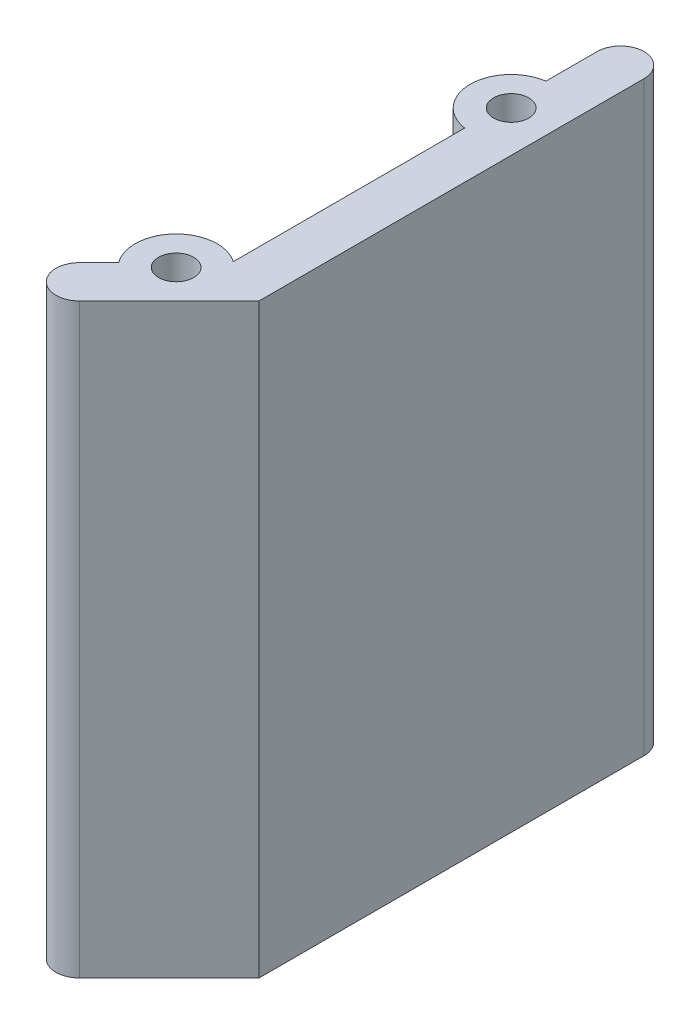
ISO-10303-21;
HEADER;
FILE_DESCRIPTION(('STEP AP214'),'2;1');
FILE_NAME('part.step','',(''),(''),'','','');
FILE_SCHEMA(('AUTOMOTIVE_DESIGN { 1 0 10303 214 1 1 1 1 }'));
ENDSEC;
DATA;
#1=APPLICATION_CONTEXT('core data for automotive mechanical design processes');
#2=APPLICATION_PROTOCOL_DEFINITION('international standard','automotive_design',2000,#1);
#3=PRODUCT_CONTEXT('',#1,'mechanical');
#4=PRODUCT('Part','Part','',(#3));
#5=PRODUCT_RELATED_PRODUCT_CATEGORY('part','',(#4));
#6=PRODUCT_DEFINITION_FORMATION('','',#4);
#7=PRODUCT_DEFINITION_CONTEXT('part definition',#1,'design');
#8=PRODUCT_DEFINITION('design','',#6,#7);
#9=PRODUCT_DEFINITION_SHAPE('','',#8);
#10=(LENGTH_UNIT() NAMED_UNIT(*) SI_UNIT(.MILLI.,.METRE.));
#11=(NAMED_UNIT(*) PLANE_ANGLE_UNIT() SI_UNIT($,.RADIAN.));
#12=(NAMED_UNIT(*) SI_UNIT($,.STERADIAN.) SOLID_ANGLE_UNIT());
#13=UNCERTAINTY_MEASURE_WITH_UNIT(LENGTH_MEASURE(1.E-05),#10,'distance_accuracy_value','');
#14=(GEOMETRIC_REPRESENTATION_CONTEXT(3) GLOBAL_UNCERTAINTY_ASSIGNED_CONTEXT((#13)) GLOBAL_UNIT_ASSIGNED_CONTEXT((#10,
#11,#12)) REPRESENTATION_CONTEXT('',''));
#15=CARTESIAN_POINT('',(0.,0.,0.));
#16=DIRECTION('',(0.,0.,1.));
#17=DIRECTION('',(1.,0.,0.));
#18=AXIS2_PLACEMENT_3D('',#15,#16,#17);
#19=CARTESIAN_POINT('',(-2.,50.,-0.828427124746196));
#20=DIRECTION('',(0.707106781186546,0.,0.707106781186549));
#21=DIRECTION('',(0.707106781186549,0.,-0.707106781186546));
#22=AXIS2_PLACEMENT_3D('',#19,#20,#21);
#23=PLANE('',#22);
#24=DIRECTION('',(-0.707106781186549,0.,0.707106781186546));
#25=VECTOR('',#24,1.);
#26=CARTESIAN_POINT('',(-2.,40.,-0.828427124746196));
#27=LINE('',#26,#25);
#28=CARTESIAN_POINT('',(-3.36396103067892,40.,0.535533905932728));
#29=VERTEX_POINT('',#28);
#30=CARTESIAN_POINT('',(-5.36396103067893,40.,2.53553390593273));
#31=VERTEX_POINT('',#30);
#32=EDGE_CURVE('E142',#29,#31,#27,.T.);
#33=ORIENTED_EDGE('',*,*,#32,.F.);
#34=DIRECTION('',(0.,-1.,0.));
#35=VECTOR('',#34,1.);
#36=CARTESIAN_POINT('',(-3.36396103067892,50.,0.535533905932728));
#37=LINE('',#36,#35);
#38=CARTESIAN_POINT('',(-3.36396103067892,10.,0.535533905932728));
#39=VERTEX_POINT('',#38);
#40=EDGE_CURVE('E151',#39,#29,#37,.F.);
#41=ORIENTED_EDGE('',*,*,#40,.F.);
#42=DIRECTION('',(0.707106781186549,0.,-0.707106781186546));
#43=VECTOR('',#42,1.);
#44=CARTESIAN_POINT('',(-2.,10.,-0.828427124746196));
#45=LINE('',#44,#43);
#46=CARTESIAN_POINT('',(-5.36396103067893,10.,2.53553390593273));
#47=VERTEX_POINT('',#46);
#48=EDGE_CURVE('E264',#47,#39,#45,.T.);
#49=ORIENTED_EDGE('',*,*,#48,.F.);
#50=DIRECTION('',(0.,-1.,0.));
#51=VECTOR('',#50,1.);
#52=CARTESIAN_POINT('',(-5.36396103067893,50.,2.53553390593273));
#53=LINE('',#52,#51);
#54=EDGE_CURVE('E152',#31,#47,#53,.T.);
#55=ORIENTED_EDGE('',*,*,#54,.F.);
#56=EDGE_LOOP('',(#33,#41,#49,#55));
#57=FACE_BOUND('',#56,.T.);
#58=ADVANCED_FACE('F45',(#57),#23,.F.);
#59=CARTESIAN_POINT('',(-2.,50.,-32.));
#60=DIRECTION('',(1.,0.,0.));
#61=DIRECTION('',(0.,0.,-1.));
#62=AXIS2_PLACEMENT_3D('',#59,#60,#61);
#63=PLANE('',#62);
#64=DIRECTION('',(0.,0.,1.));
#65=VECTOR('',#64,1.);
#66=CARTESIAN_POINT('',(-2.,40.,-32.));
#67=LINE('',#66,#65);
#68=CARTESIAN_POINT('',(-2.,40.,-25.5857864376269));
#69=VERTEX_POINT('',#68);
#70=CARTESIAN_POINT('',(-2.,40.,-22.7573593128807));
#71=VERTEX_POINT('',#70);
#72=EDGE_CURVE('E153',#69,#71,#67,.T.);
#73=ORIENTED_EDGE('',*,*,#72,.F.);
#74=DIRECTION('',(0.,-1.,0.));
#75=VECTOR('',#74,1.);
#76=CARTESIAN_POINT('',(-2.,50.,-25.5857864376269));
#77=LINE('',#76,#75);
#78=CARTESIAN_POINT('',(-2.,10.,-25.5857864376269));
#79=VERTEX_POINT('',#78);
#80=EDGE_CURVE('E181',#79,#69,#77,.F.);
#81=ORIENTED_EDGE('',*,*,#80,.F.);
#82=DIRECTION('',(0.,0.,-1.));
#83=VECTOR('',#82,1.);
#84=CARTESIAN_POINT('',(-2.,10.,-32.));
#85=LINE('',#84,#83);
#86=CARTESIAN_POINT('',(-2.,10.,-22.7573593128807));
#87=VERTEX_POINT('',#86);
#88=EDGE_CURVE('E261',#87,#79,#85,.T.);
#89=ORIENTED_EDGE('',*,*,#88,.F.);
#90=DIRECTION('',(0.,-1.,0.));
#91=VECTOR('',#90,1.);
#92=CARTESIAN_POINT('',(-2.,50.,-22.7573593128807));
#93=LINE('',#92,#91);
#94=EDGE_CURVE('E186',#71,#87,#93,.T.);
#95=ORIENTED_EDGE('',*,*,#94,.F.);
#96=EDGE_LOOP('',(#73,#81,#89,#95));
#97=FACE_BOUND('',#96,.T.);
#98=ADVANCED_FACE('F281',(#97),#63,.F.);
#99=DIRECTION('',(-0.707106781186549,0.,0.707106781186546));
#100=VECTOR('',#99,1.);
#101=CARTESIAN_POINT('',(-2.,50.,-0.828427124746196));
#102=LINE('',#101,#100);
#103=CARTESIAN_POINT('',(-6.81345077346211,50.,3.9850236487159));
#104=VERTEX_POINT('',#103);
#105=CARTESIAN_POINT('',(-8.48528137423858,50.,5.65685424949237));
#106=VERTEX_POINT('',#105);
#107=EDGE_CURVE('E60',#104,#106,#102,.T.);
#108=ORIENTED_EDGE('',*,*,#107,.F.);
#109=DIRECTION('',(0.,-1.,0.));
#110=VECTOR('',#109,1.);
#111=CARTESIAN_POINT('',(-6.81345077346211,50.,3.9850236487159));
#112=LINE('',#111,#110);
#113=CARTESIAN_POINT('',(-6.81345077346211,0.,3.9850236487159));
#114=VERTEX_POINT('',#113);
#115=EDGE_CURVE('E162',#104,#114,#112,.T.);
#116=ORIENTED_EDGE('',*,*,#115,.T.);
#117=DIRECTION('',(-0.707106781186549,0.,0.707106781186546));
#118=VECTOR('',#117,1.);
#119=CARTESIAN_POINT('',(-2.,0.,-0.828427124746196));
#120=LINE('',#119,#118);
#121=CARTESIAN_POINT('',(-8.48528137423858,0.,5.65685424949237));
#122=VERTEX_POINT('',#121);
#123=EDGE_CURVE('E214',#114,#122,#120,.T.);
#124=ORIENTED_EDGE('',*,*,#123,.T.);
#125=DIRECTION('',(0.,-1.,0.));
#126=VECTOR('',#125,1.);
#127=CARTESIAN_POINT('',(-8.48528137423858,50.,5.65685424949237));
#128=LINE('',#127,#126);
#129=EDGE_CURVE('E53',#106,#122,#128,.T.);
#130=ORIENTED_EDGE('',*,*,#129,.F.);
#131=EDGE_LOOP('',(#108,#116,#124,#130));
#132=FACE_BOUND('',#131,.T.);
#133=ADVANCED_FACE('F303',(#132),#23,.F.);
#134=DIRECTION('',(0.,0.,1.));
#135=VECTOR('',#134,1.);
#136=CARTESIAN_POINT('',(-2.,0.,-32.));
#137=LINE('',#136,#135);
#138=CARTESIAN_POINT('',(-2.,0.,-20.7074712601161));
#139=VERTEX_POINT('',#138);
#140=CARTESIAN_POINT('',(-2.,0.,-0.97591900725157));
#141=VERTEX_POINT('',#140);
#142=EDGE_CURVE('E211',#139,#141,#137,.T.);
#143=ORIENTED_EDGE('',*,*,#142,.T.);
#144=DIRECTION('',(0.,-1.,0.));
#145=VECTOR('',#144,1.);
#146=CARTESIAN_POINT('',(-2.,50.,-0.97591900725157));
#147=LINE('',#146,#145);
#148=CARTESIAN_POINT('',(-2.,50.,-0.97591900725157));
#149=VERTEX_POINT('',#148);
#150=EDGE_CURVE('E68',#141,#149,#147,.F.);
#151=ORIENTED_EDGE('',*,*,#150,.T.);
#152=DIRECTION('',(0.,0.,1.));
#153=VECTOR('',#152,1.);
#154=CARTESIAN_POINT('',(-2.,50.,-32.));
#155=LINE('',#154,#153);
#156=CARTESIAN_POINT('',(-2.,50.,-20.7074712601161));
#157=VERTEX_POINT('',#156);
#158=EDGE_CURVE('E196',#157,#149,#155,.T.);
#159=ORIENTED_EDGE('',*,*,#158,.F.);
#160=DIRECTION('',(0.,-1.,0.));
#161=VECTOR('',#160,1.);
#162=CARTESIAN_POINT('',(-2.,50.,-20.7074712601161));
#163=LINE('',#162,#161);
#164=EDGE_CURVE('E190',#157,#139,#163,.T.);
#165=ORIENTED_EDGE('',*,*,#164,.T.);
#166=EDGE_LOOP('',(#143,#151,#159,#165));
#167=FACE_BOUND('',#166,.T.);
#168=ADVANCED_FACE('F307',(#167),#63,.F.);
#169=CARTESIAN_POINT('',(0.,50.,-32.));
#170=DIRECTION('',(0.,-1.,0.));
#171=DIRECTION('',(0.,0.,-1.));
#172=AXIS2_PLACEMENT_3D('',#169,#170,#171);
#173=CYLINDRICAL_SURFACE('',#172,2.);
#174=CARTESIAN_POINT('',(0.,0.,-32.));
#175=DIRECTION('',(0.,1.,0.));
#176=DIRECTION('',(0.,0.,-1.));
#177=AXIS2_PLACEMENT_3D('',#174,#175,#176);
#178=CIRCLE('',#177,2.);
#179=CARTESIAN_POINT('',(2.,0.,-32.));
#180=VERTEX_POINT('',#179);
#181=CARTESIAN_POINT('',(-2.,0.,-32.));
#182=VERTEX_POINT('',#181);
#183=EDGE_CURVE('E192',#180,#182,#178,.T.);
#184=ORIENTED_EDGE('',*,*,#183,.T.);
#185=DIRECTION('',(0.,-1.,0.));
#186=VECTOR('',#185,1.);
#187=CARTESIAN_POINT('',(-2.,50.,-32.));
#188=LINE('',#187,#186);
#189=CARTESIAN_POINT('',(-2.,50.,-32.));
#190=VERTEX_POINT('',#189);
#191=EDGE_CURVE('E12',#190,#182,#188,.T.);
#192=ORIENTED_EDGE('',*,*,#191,.F.);
#193=CARTESIAN_POINT('',(0.,50.,-32.));
#194=DIRECTION('',(0.,1.,0.));
#195=DIRECTION('',(0.,0.,-1.));
#196=AXIS2_PLACEMENT_3D('',#193,#194,#195);
#197=CIRCLE('',#196,2.);
#198=CARTESIAN_POINT('',(2.,50.,-32.));
#199=VERTEX_POINT('',#198);
#200=EDGE_CURVE('E193',#199,#190,#197,.T.);
#201=ORIENTED_EDGE('',*,*,#200,.F.);
#202=DIRECTION('',(0.,-1.,0.));
#203=VECTOR('',#202,1.);
#204=CARTESIAN_POINT('',(2.,50.,-32.));
#205=LINE('',#204,#203);
#206=EDGE_CURVE('E208',#199,#180,#205,.T.);
#207=ORIENTED_EDGE('',*,*,#206,.T.);
#208=EDGE_LOOP('',(#184,#192,#201,#207));
#209=FACE_BOUND('',#208,.T.);
#210=ADVANCED_FACE('F47',(#209),#173,.T.);
#211=CARTESIAN_POINT('',(-2.,0.,-27.6356744903916));
#212=VERTEX_POINT('',#211);
#213=EDGE_CURVE('E212',#182,#212,#137,.T.);
#214=ORIENTED_EDGE('',*,*,#213,.T.);
#215=DIRECTION('',(0.,-1.,0.));
#216=VECTOR('',#215,1.);
#217=CARTESIAN_POINT('',(-2.,50.,-27.6356744903916));
#218=LINE('',#217,#216);
#219=CARTESIAN_POINT('',(-2.,50.,-27.6356744903916));
#220=VERTEX_POINT('',#219);
#221=EDGE_CURVE('E188',#212,#220,#218,.F.);
#222=ORIENTED_EDGE('',*,*,#221,.T.);
#223=EDGE_CURVE('E198',#190,#220,#155,.T.);
#224=ORIENTED_EDGE('',*,*,#223,.F.);
#225=ORIENTED_EDGE('',*,*,#191,.T.);
#226=EDGE_LOOP('',(#214,#222,#224,#225));
#227=FACE_BOUND('',#226,.T.);
#228=ADVANCED_FACE('F308',(#227),#63,.F.);
#229=CARTESIAN_POINT('',(-7.07106781186549,50.,7.07106781186546));
#230=DIRECTION('',(0.,-1.,0.));
#231=DIRECTION('',(0.,0.,-1.));
#232=AXIS2_PLACEMENT_3D('',#229,#230,#231);
#233=CYLINDRICAL_SURFACE('',#232,2.);
#234=CARTESIAN_POINT('',(-7.07106781186549,0.,7.07106781186546));
#235=DIRECTION('',(0.,1.,0.));
#236=DIRECTION('',(0.,0.,1.));
#237=AXIS2_PLACEMENT_3D('',#234,#235,#236);
#238=CIRCLE('',#237,2.);
#239=CARTESIAN_POINT('',(-5.65685424949239,0.,8.48528137423856));
#240=VERTEX_POINT('',#239);
#241=EDGE_CURVE('E216',#122,#240,#238,.T.);
#242=ORIENTED_EDGE('',*,*,#241,.T.);
#243=DIRECTION('',(0.,-1.,0.));
#244=VECTOR('',#243,1.);
#245=CARTESIAN_POINT('',(-5.65685424949239,50.,8.48528137423856));
#246=LINE('',#245,#244);
#247=CARTESIAN_POINT('',(-5.65685424949239,50.,8.48528137423856));
#248=VERTEX_POINT('',#247);
#249=EDGE_CURVE('E226',#248,#240,#246,.T.);
#250=ORIENTED_EDGE('',*,*,#249,.F.);
#251=CARTESIAN_POINT('',(-7.07106781186549,50.,7.07106781186546));
#252=DIRECTION('',(0.,1.,0.));
#253=DIRECTION('',(0.,0.,1.));
#254=AXIS2_PLACEMENT_3D('',#251,#252,#253);
#255=CIRCLE('',#254,2.);
#256=EDGE_CURVE('E202',#106,#248,#255,.T.);
#257=ORIENTED_EDGE('',*,*,#256,.F.);
#258=ORIENTED_EDGE('',*,*,#129,.T.);
#259=EDGE_LOOP('',(#242,#250,#257,#258));
#260=FACE_BOUND('',#259,.T.);
#261=ADVANCED_FACE('F232',(#260),#233,.T.);
#262=CARTESIAN_POINT('',(2.,50.,0.828427124746188));
#263=DIRECTION('',(-0.707106781186546,0.,-0.707106781186549));
#264=DIRECTION('',(-0.707106781186549,0.,0.707106781186546));
#265=AXIS2_PLACEMENT_3D('',#262,#263,#264);
#266=PLANE('',#265);
#267=DIRECTION('',(0.,-1.,0.));
#268=VECTOR('',#267,1.);
#269=CARTESIAN_POINT('',(2.,50.,0.828427124746188));
#270=LINE('',#269,#268);
#271=CARTESIAN_POINT('',(2.,50.,0.828427124746188));
#272=VERTEX_POINT('',#271);
#273=CARTESIAN_POINT('',(2.,0.,0.828427124746188));
#274=VERTEX_POINT('',#273);
#275=EDGE_CURVE('E223',#272,#274,#270,.T.);
#276=ORIENTED_EDGE('',*,*,#275,.F.);
#277=DIRECTION('',(0.707106781186549,0.,-0.707106781186546));
#278=VECTOR('',#277,1.);
#279=CARTESIAN_POINT('',(2.,50.,0.828427124746188));
#280=LINE('',#279,#278);
#281=EDGE_CURVE('E204',#248,#272,#280,.T.);
#282=ORIENTED_EDGE('',*,*,#281,.F.);
#283=ORIENTED_EDGE('',*,*,#249,.T.);
#284=DIRECTION('',(0.707106781186549,0.,-0.707106781186546));
#285=VECTOR('',#284,1.);
#286=CARTESIAN_POINT('',(2.,0.,0.828427124746188));
#287=LINE('',#286,#285);
#288=EDGE_CURVE('E218',#240,#274,#287,.T.);
#289=ORIENTED_EDGE('',*,*,#288,.T.);
#290=EDGE_LOOP('',(#276,#282,#283,#289));
#291=FACE_BOUND('',#290,.T.);
#292=ADVANCED_FACE('F244',(#291),#266,.F.);
#293=CARTESIAN_POINT('',(2.,50.,-32.));
#294=DIRECTION('',(-1.,0.,0.));
#295=DIRECTION('',(0.,0.,1.));
#296=AXIS2_PLACEMENT_3D('',#293,#294,#295);
#297=PLANE('',#296);
#298=ORIENTED_EDGE('',*,*,#206,.F.);
#299=DIRECTION('',(0.,0.,-1.));
#300=VECTOR('',#299,1.);
#301=CARTESIAN_POINT('',(2.,50.,-32.));
#302=LINE('',#301,#300);
#303=EDGE_CURVE('E206',#272,#199,#302,.T.);
#304=ORIENTED_EDGE('',*,*,#303,.F.);
#305=ORIENTED_EDGE('',*,*,#275,.T.);
#306=DIRECTION('',(0.,0.,-1.));
#307=VECTOR('',#306,1.);
#308=CARTESIAN_POINT('',(2.,0.,-32.));
#309=LINE('',#308,#307);
#310=EDGE_CURVE('E197',#274,#180,#309,.T.);
#311=ORIENTED_EDGE('',*,*,#310,.T.);
#312=EDGE_LOOP('',(#298,#304,#305,#311));
#313=FACE_BOUND('',#312,.T.);
#314=ADVANCED_FACE('F249',(#313),#297,.F.);
#315=CARTESIAN_POINT('',(0.,50.,-32.));
#316=DIRECTION('',(0.,-1.,0.));
#317=DIRECTION('',(0.,0.,-1.));
#318=AXIS2_PLACEMENT_3D('',#315,#316,#317);
#319=PLANE('',#318);
#320=CARTESIAN_POINT('',(-4.01040764008566,50.,1.889087296526));
#321=DIRECTION('',(0.,-1.,0.));
#322=DIRECTION('',(0.,0.,-1.));
#323=AXIS2_PLACEMENT_3D('',#320,#321,#322);
#324=CIRCLE('',#323,3.5);
#325=EDGE_CURVE('E257',#104,#149,#324,.T.);
#326=ORIENTED_EDGE('',*,*,#325,.F.);
#327=ORIENTED_EDGE('',*,*,#107,.T.);
#328=ORIENTED_EDGE('',*,*,#256,.T.);
#329=ORIENTED_EDGE('',*,*,#281,.T.);
#330=ORIENTED_EDGE('',*,*,#303,.T.);
#331=ORIENTED_EDGE('',*,*,#200,.T.);
#332=ORIENTED_EDGE('',*,*,#223,.T.);
#333=CARTESIAN_POINT('',(-1.5,50.,-24.1715728752538));
#334=DIRECTION('',(0.,-1.,0.));
#335=DIRECTION('',(0.,0.,-1.));
#336=AXIS2_PLACEMENT_3D('',#333,#334,#335);
#337=CIRCLE('',#336,3.5);
#338=EDGE_CURVE('E178',#157,#220,#337,.T.);
#339=ORIENTED_EDGE('',*,*,#338,.F.);
#340=ORIENTED_EDGE('',*,*,#158,.T.);
#341=EDGE_LOOP('',(#326,#327,#328,#329,#330,#331,#332,#339,#340));
#342=FACE_BOUND('',#341,.T.);
#343=CARTESIAN_POINT('',(-4.01040764008566,50.,1.889087296526));
#344=DIRECTION('',(0.,-1.,0.));
#345=DIRECTION('',(0.,0.,-1.));
#346=AXIS2_PLACEMENT_3D('',#343,#344,#345);
#347=CIRCLE('',#346,1.5);
#348=CARTESIAN_POINT('',(-4.01040764008566,50.,0.389087296525997));
#349=VERTEX_POINT('',#348);
#350=EDGE_CURVE('E165',#349,#349,#347,.T.);
#351=ORIENTED_EDGE('',*,*,#350,.T.);
#352=EDGE_LOOP('',(#351));
#353=FACE_BOUND('',#352,.T.);
#354=CARTESIAN_POINT('',(-1.5,50.,-24.1715728752538));
#355=DIRECTION('',(0.,-1.,0.));
#356=DIRECTION('',(0.,0.,-1.));
#357=AXIS2_PLACEMENT_3D('',#354,#355,#356);
#358=CIRCLE('',#357,1.5);
#359=CARTESIAN_POINT('',(-1.5,50.,-25.6715728752538));
#360=VERTEX_POINT('',#359);
#361=EDGE_CURVE('E172',#360,#360,#358,.T.);
#362=ORIENTED_EDGE('',*,*,#361,.T.);
#363=EDGE_LOOP('',(#362));
#364=FACE_BOUND('',#363,.T.);
#365=ADVANCED_FACE('F253',(#342,#353,#364),#319,.F.);
#366=CARTESIAN_POINT('',(0.,0.,-32.));
#367=DIRECTION('',(0.,-1.,0.));
#368=DIRECTION('',(0.,0.,-1.));
#369=AXIS2_PLACEMENT_3D('',#366,#367,#368);
#370=PLANE('',#369);
#371=CARTESIAN_POINT('',(-4.01040764008566,0.,1.889087296526));
#372=DIRECTION('',(0.,-1.,0.));
#373=DIRECTION('',(0.,0.,-1.));
#374=AXIS2_PLACEMENT_3D('',#371,#372,#373);
#375=CIRCLE('',#374,1.5);
#376=CARTESIAN_POINT('',(-4.01040764008566,0.,0.389087296525997));
#377=VERTEX_POINT('',#376);
#378=EDGE_CURVE('E160',#377,#377,#375,.T.);
#379=ORIENTED_EDGE('',*,*,#378,.F.);
#380=EDGE_LOOP('',(#379));
#381=FACE_BOUND('',#380,.T.);
#382=CARTESIAN_POINT('',(-1.5,0.,-24.1715728752538));
#383=DIRECTION('',(0.,-1.,0.));
#384=DIRECTION('',(0.,0.,-1.));
#385=AXIS2_PLACEMENT_3D('',#382,#383,#384);
#386=CIRCLE('',#385,1.5);
#387=CARTESIAN_POINT('',(-1.5,0.,-25.6715728752538));
#388=VERTEX_POINT('',#387);
#389=EDGE_CURVE('E171',#388,#388,#386,.T.);
#390=ORIENTED_EDGE('',*,*,#389,.F.);
#391=EDGE_LOOP('',(#390));
#392=FACE_BOUND('',#391,.T.);
#393=ORIENTED_EDGE('',*,*,#123,.F.);
#394=CARTESIAN_POINT('',(-4.01040764008566,0.,1.889087296526));
#395=DIRECTION('',(0.,-1.,0.));
#396=DIRECTION('',(0.,0.,-1.));
#397=AXIS2_PLACEMENT_3D('',#394,#395,#396);
#398=CIRCLE('',#397,3.5);
#399=EDGE_CURVE('E260',#114,#141,#398,.T.);
#400=ORIENTED_EDGE('',*,*,#399,.T.);
#401=ORIENTED_EDGE('',*,*,#142,.F.);
#402=CARTESIAN_POINT('',(-1.5,0.,-24.1715728752538));
#403=DIRECTION('',(0.,-1.,0.));
#404=DIRECTION('',(0.,0.,-1.));
#405=AXIS2_PLACEMENT_3D('',#402,#403,#404);
#406=CIRCLE('',#405,3.5);
#407=EDGE_CURVE('E175',#139,#212,#406,.T.);
#408=ORIENTED_EDGE('',*,*,#407,.T.);
#409=ORIENTED_EDGE('',*,*,#213,.F.);
#410=ORIENTED_EDGE('',*,*,#183,.F.);
#411=ORIENTED_EDGE('',*,*,#310,.F.);
#412=ORIENTED_EDGE('',*,*,#288,.F.);
#413=ORIENTED_EDGE('',*,*,#241,.F.);
#414=EDGE_LOOP('',(#393,#400,#401,#408,#409,#410,#411,#412,#413));
#415=FACE_BOUND('',#414,.T.);
#416=ADVANCED_FACE('F237',(#381,#392,#415),#370,.T.);
#417=CARTESIAN_POINT('',(-1.5,50.,-24.1715728752538));
#418=DIRECTION('',(0.,-1.,0.));
#419=DIRECTION('',(0.,0.,-1.));
#420=AXIS2_PLACEMENT_3D('',#417,#418,#419);
#421=CYLINDRICAL_SURFACE('',#420,3.5);
#422=ORIENTED_EDGE('',*,*,#164,.F.);
#423=ORIENTED_EDGE('',*,*,#338,.T.);
#424=ORIENTED_EDGE('',*,*,#221,.F.);
#425=ORIENTED_EDGE('',*,*,#407,.F.);
#426=EDGE_LOOP('',(#422,#423,#424,#425));
#427=FACE_BOUND('',#426,.T.);
#428=ADVANCED_FACE('F327',(#427),#421,.T.);
#429=CARTESIAN_POINT('',(-1.5,50.,-24.1715728752538));
#430=DIRECTION('',(0.,-1.,0.));
#431=DIRECTION('',(0.,0.,-1.));
#432=AXIS2_PLACEMENT_3D('',#429,#430,#431);
#433=CYLINDRICAL_SURFACE('',#432,1.5);
#434=ORIENTED_EDGE('',*,*,#361,.F.);
#435=EDGE_LOOP('',(#434));
#436=FACE_BOUND('',#435,.T.);
#437=ORIENTED_EDGE('',*,*,#80,.T.);
#438=CARTESIAN_POINT('',(-1.5,40.,-24.1715728752538));
#439=DIRECTION('',(0.,1.,0.));
#440=DIRECTION('',(0.,0.,1.));
#441=AXIS2_PLACEMENT_3D('',#438,#439,#440);
#442=CIRCLE('',#441,1.5);
#443=EDGE_CURVE('E146',#71,#69,#442,.T.);
#444=ORIENTED_EDGE('',*,*,#443,.F.);
#445=ORIENTED_EDGE('',*,*,#94,.T.);
#446=CARTESIAN_POINT('',(-1.5,10.,-24.1715728752538));
#447=DIRECTION('',(0.,-1.,0.));
#448=DIRECTION('',(0.,0.,-1.));
#449=AXIS2_PLACEMENT_3D('',#446,#447,#448);
#450=CIRCLE('',#449,1.5);
#451=EDGE_CURVE('E268',#79,#87,#450,.T.);
#452=ORIENTED_EDGE('',*,*,#451,.F.);
#453=EDGE_LOOP('',(#437,#444,#445,#452));
#454=FACE_BOUND('',#453,.T.);
#455=ORIENTED_EDGE('',*,*,#389,.T.);
#456=EDGE_LOOP('',(#455));
#457=FACE_BOUND('',#456,.T.);
#458=ADVANCED_FACE('F284',(#436,#454,#457),#433,.F.);
#459=CARTESIAN_POINT('',(-4.01040764008566,50.,1.889087296526));
#460=DIRECTION('',(0.,-1.,0.));
#461=DIRECTION('',(0.,0.,-1.));
#462=AXIS2_PLACEMENT_3D('',#459,#460,#461);
#463=CYLINDRICAL_SURFACE('',#462,3.5);
#464=ORIENTED_EDGE('',*,*,#150,.F.);
#465=ORIENTED_EDGE('',*,*,#399,.F.);
#466=ORIENTED_EDGE('',*,*,#115,.F.);
#467=ORIENTED_EDGE('',*,*,#325,.T.);
#468=EDGE_LOOP('',(#464,#465,#466,#467));
#469=FACE_BOUND('',#468,.T.);
#470=ADVANCED_FACE('F297',(#469),#463,.T.);
#471=CARTESIAN_POINT('',(-4.01040764008566,50.,1.889087296526));
#472=DIRECTION('',(0.,-1.,0.));
#473=DIRECTION('',(0.,0.,-1.));
#474=AXIS2_PLACEMENT_3D('',#471,#472,#473);
#475=CYLINDRICAL_SURFACE('',#474,1.5);
#476=ORIENTED_EDGE('',*,*,#350,.F.);
#477=EDGE_LOOP('',(#476));
#478=FACE_BOUND('',#477,.T.);
#479=ORIENTED_EDGE('',*,*,#40,.T.);
#480=CARTESIAN_POINT('',(-4.01040764008566,40.,1.889087296526));
#481=DIRECTION('',(0.,1.,0.));
#482=DIRECTION('',(0.,0.,1.));
#483=AXIS2_PLACEMENT_3D('',#480,#481,#482);
#484=CIRCLE('',#483,1.5);
#485=EDGE_CURVE('E139',#31,#29,#484,.T.);
#486=ORIENTED_EDGE('',*,*,#485,.F.);
#487=ORIENTED_EDGE('',*,*,#54,.T.);
#488=CARTESIAN_POINT('',(-4.01040764008566,10.,1.889087296526));
#489=DIRECTION('',(0.,-1.,0.));
#490=DIRECTION('',(0.,0.,-1.));
#491=AXIS2_PLACEMENT_3D('',#488,#489,#490);
#492=CIRCLE('',#491,1.5);
#493=EDGE_CURVE('E159',#39,#47,#492,.T.);
#494=ORIENTED_EDGE('',*,*,#493,.F.);
#495=EDGE_LOOP('',(#479,#486,#487,#494));
#496=FACE_BOUND('',#495,.T.);
#497=ORIENTED_EDGE('',*,*,#378,.T.);
#498=EDGE_LOOP('',(#497));
#499=FACE_BOUND('',#498,.T.);
#500=ADVANCED_FACE('F156',(#478,#496,#499),#475,.F.);
#501=CARTESIAN_POINT('',(-1.5,10.,-24.1715728752538));
#502=DIRECTION('',(0.,-1.,0.));
#503=DIRECTION('',(0.,0.,-1.));
#504=AXIS2_PLACEMENT_3D('',#501,#502,#503);
#505=PLANE('',#504);
#506=ORIENTED_EDGE('',*,*,#88,.T.);
#507=ORIENTED_EDGE('',*,*,#451,.T.);
#508=EDGE_LOOP('',(#506,#507));
#509=FACE_BOUND('',#508,.T.);
#510=ADVANCED_FACE('F287',(#509),#505,.T.);
#511=CARTESIAN_POINT('',(-4.01040764008566,10.,1.889087296526));
#512=DIRECTION('',(0.,-1.,0.));
#513=DIRECTION('',(0.,0.,-1.));
#514=AXIS2_PLACEMENT_3D('',#511,#512,#513);
#515=PLANE('',#514);
#516=ORIENTED_EDGE('',*,*,#48,.T.);
#517=ORIENTED_EDGE('',*,*,#493,.T.);
#518=EDGE_LOOP('',(#516,#517));
#519=FACE_BOUND('',#518,.T.);
#520=ADVANCED_FACE('F289',(#519),#515,.T.);
#521=CARTESIAN_POINT('',(-1.5,40.,-24.1715728752538));
#522=DIRECTION('',(0.,1.,0.));
#523=DIRECTION('',(0.,0.,1.));
#524=AXIS2_PLACEMENT_3D('',#521,#522,#523);
#525=PLANE('',#524);
#526=ORIENTED_EDGE('',*,*,#72,.T.);
#527=ORIENTED_EDGE('',*,*,#443,.T.);
#528=EDGE_LOOP('',(#526,#527));
#529=FACE_BOUND('',#528,.T.);
#530=ADVANCED_FACE('F276',(#529),#525,.T.);
#531=CARTESIAN_POINT('',(-4.01040764008566,40.,1.889087296526));
#532=DIRECTION('',(0.,1.,0.));
#533=DIRECTION('',(0.,0.,1.));
#534=AXIS2_PLACEMENT_3D('',#531,#532,#533);
#535=PLANE('',#534);
#536=ORIENTED_EDGE('',*,*,#32,.T.);
#537=ORIENTED_EDGE('',*,*,#485,.T.);
#538=EDGE_LOOP('',(#536,#537));
#539=FACE_BOUND('',#538,.T.);
#540=ADVANCED_FACE('F141',(#539),#535,.T.);
#541=CLOSED_SHELL('',(#58,#98,#133,#168,#210,#228,#261,#292,#314,#365,#416,#428,#458,#470,#500,
#510,#520,#530,#540));
#542=MANIFOLD_SOLID_BREP('B2',#541);
#543=ADVANCED_BREP_SHAPE_REPRESENTATION('',(#18,#542),#14);
#544=SHAPE_DEFINITION_REPRESENTATION(#9,#543);
ENDSEC;
END-ISO-10303-21;
